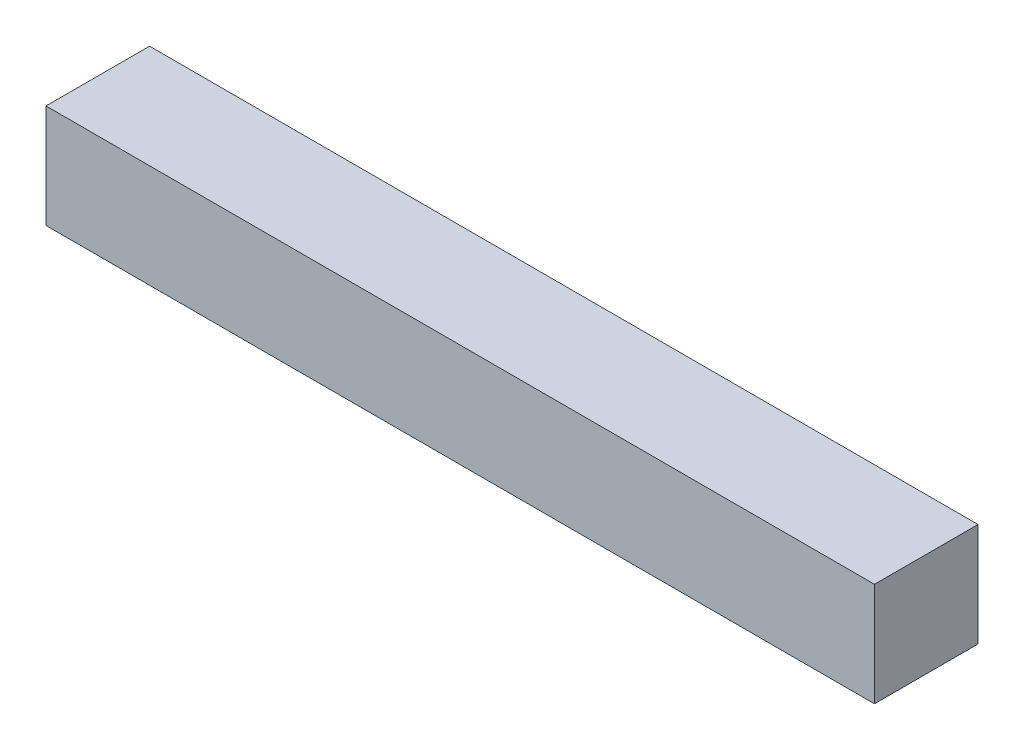
ISO-10303-21;
HEADER;
FILE_DESCRIPTION(('STEP AP214'),'2;1');
FILE_NAME('part.step','',(''),(''),'','','');
FILE_SCHEMA(('AUTOMOTIVE_DESIGN { 1 0 10303 214 1 1 1 1 }'));
ENDSEC;
DATA;
#1=APPLICATION_CONTEXT('core data for automotive mechanical design processes');
#2=APPLICATION_PROTOCOL_DEFINITION('international standard','automotive_design',2000,#1);
#3=PRODUCT_CONTEXT('',#1,'mechanical');
#4=PRODUCT('Part','Part','',(#3));
#5=PRODUCT_RELATED_PRODUCT_CATEGORY('part','',(#4));
#6=PRODUCT_DEFINITION_FORMATION('','',#4);
#7=PRODUCT_DEFINITION_CONTEXT('part definition',#1,'design');
#8=PRODUCT_DEFINITION('design','',#6,#7);
#9=PRODUCT_DEFINITION_SHAPE('','',#8);
#10=(LENGTH_UNIT() NAMED_UNIT(*) SI_UNIT(.MILLI.,.METRE.));
#11=(NAMED_UNIT(*) PLANE_ANGLE_UNIT() SI_UNIT($,.RADIAN.));
#12=(NAMED_UNIT(*) SI_UNIT($,.STERADIAN.) SOLID_ANGLE_UNIT());
#13=UNCERTAINTY_MEASURE_WITH_UNIT(LENGTH_MEASURE(1.E-05),#10,'distance_accuracy_value','');
#14=(GEOMETRIC_REPRESENTATION_CONTEXT(3) GLOBAL_UNCERTAINTY_ASSIGNED_CONTEXT((#13)) GLOBAL_UNIT_ASSIGNED_CONTEXT((#10,
#11,#12)) REPRESENTATION_CONTEXT('',''));
#15=CARTESIAN_POINT('',(0.,0.,0.));
#16=DIRECTION('',(0.,0.,1.));
#17=DIRECTION('',(1.,0.,0.));
#18=AXIS2_PLACEMENT_3D('',#15,#16,#17);
#19=CARTESIAN_POINT('',(1020.85832331262,102.108,102.108));
#20=DIRECTION('',(0.,1.,0.));
#21=DIRECTION('',(0.,0.,-1.));
#22=AXIS2_PLACEMENT_3D('',#19,#20,#21);
#23=PLANE('',#22);
#24=CARTESIAN_POINT('',(1020.85832331262,102.108,102.108));
#25=CARTESIAN_POINT('',(680.378560960894,102.108,102.108));
#26=CARTESIAN_POINT('',(339.898798609163,102.108,102.108));
#27=CARTESIAN_POINT('',(-0.580963742567401,102.108,102.108));
#28=B_SPLINE_CURVE_WITH_KNOTS('',3,(#24,#25,#26,#27),.UNSPECIFIED.,.F.,.F.,(4,4),(0.,1.),.UNSPECIFIED.);
#29=CARTESIAN_POINT('',(1020.85832331262,102.108,102.108));
#30=VERTEX_POINT('',#29);
#31=CARTESIAN_POINT('',(-0.580963742567401,102.108,102.108));
#32=VERTEX_POINT('',#31);
#33=EDGE_CURVE('E124',#30,#32,#28,.T.);
#34=ORIENTED_EDGE('',*,*,#33,.F.);
#35=DIRECTION('',(-1.,0.,0.));
#36=VECTOR('',#35,1.);
#37=CARTESIAN_POINT('',(1327.18232331262,102.108,102.108));
#38=LINE('',#37,#36);
#39=CARTESIAN_POINT('',(1327.18232331262,102.108,102.108));
#40=VERTEX_POINT('',#39);
#41=EDGE_CURVE('E253',#40,#30,#38,.T.);
#42=ORIENTED_EDGE('',*,*,#41,.F.);
#43=DIRECTION('',(0.,0.,1.));
#44=VECTOR('',#43,1.);
#45=CARTESIAN_POINT('',(1327.18232331262,102.108,102.108));
#46=LINE('',#45,#44);
#47=CARTESIAN_POINT('',(1327.18232331262,102.108,-102.108));
#48=VERTEX_POINT('',#47);
#49=EDGE_CURVE('E204',#48,#40,#46,.T.);
#50=ORIENTED_EDGE('',*,*,#49,.F.);
#51=DIRECTION('',(-1.,0.,0.));
#52=VECTOR('',#51,1.);
#53=CARTESIAN_POINT('',(1327.18232331262,102.108,-102.108));
#54=LINE('',#53,#52);
#55=CARTESIAN_POINT('',(1020.85832331262,102.108,-102.108));
#56=VERTEX_POINT('',#55);
#57=EDGE_CURVE('E214',#48,#56,#54,.T.);
#58=ORIENTED_EDGE('',*,*,#57,.T.);
#59=CARTESIAN_POINT('',(1020.85832331262,102.108,-102.108));
#60=CARTESIAN_POINT('',(680.378560960894,102.108,-102.108));
#61=CARTESIAN_POINT('',(339.898798609163,102.108,-102.108));
#62=CARTESIAN_POINT('',(-0.580963742567401,102.108,-102.108));
#63=B_SPLINE_CURVE_WITH_KNOTS('',3,(#59,#60,#61,#62),.UNSPECIFIED.,.F.,.F.,(4,4),(0.,1.),.UNSPECIFIED.);
#64=CARTESIAN_POINT('',(-0.580963742567401,102.108,-102.108));
#65=VERTEX_POINT('',#64);
#66=EDGE_CURVE('E13',#56,#65,#63,.T.);
#67=ORIENTED_EDGE('',*,*,#66,.T.);
#68=DIRECTION('',(1.,0.,0.));
#69=VECTOR('',#68,1.);
#70=CARTESIAN_POINT('',(-306.904963742567,102.108,-102.108));
#71=LINE('',#70,#69);
#72=CARTESIAN_POINT('',(-306.904963742567,102.108,-102.108));
#73=VERTEX_POINT('',#72);
#74=EDGE_CURVE('E177',#73,#65,#71,.T.);
#75=ORIENTED_EDGE('',*,*,#74,.F.);
#76=DIRECTION('',(0.,0.,1.));
#77=VECTOR('',#76,1.);
#78=CARTESIAN_POINT('',(-306.904963742567,102.108,102.108));
#79=LINE('',#78,#77);
#80=CARTESIAN_POINT('',(-306.904963742567,102.108,102.108));
#81=VERTEX_POINT('',#80);
#82=EDGE_CURVE('E179',#73,#81,#79,.T.);
#83=ORIENTED_EDGE('',*,*,#82,.T.);
#84=DIRECTION('',(1.,0.,0.));
#85=VECTOR('',#84,1.);
#86=CARTESIAN_POINT('',(-306.904963742567,102.108,102.108));
#87=LINE('',#86,#85);
#88=EDGE_CURVE('E132',#81,#32,#87,.T.);
#89=ORIENTED_EDGE('',*,*,#88,.T.);
#90=EDGE_LOOP('',(#34,#42,#50,#58,#67,#75,#83,#89));
#91=FACE_BOUND('',#90,.T.);
#92=ADVANCED_FACE('F115',(#91),#23,.T.);
#93=CARTESIAN_POINT('',(1020.85832331262,-102.108,102.108));
#94=DIRECTION('',(0.,0.,1.));
#95=DIRECTION('',(0.,1.,0.));
#96=AXIS2_PLACEMENT_3D('',#93,#94,#95);
#97=PLANE('',#96);
#98=CARTESIAN_POINT('',(1020.85832331262,-102.108,102.108));
#99=CARTESIAN_POINT('',(680.378560960894,-102.108,102.108));
#100=CARTESIAN_POINT('',(339.898798609163,-102.108,102.108));
#101=CARTESIAN_POINT('',(-0.580963742567401,-102.108,102.108));
#102=B_SPLINE_CURVE_WITH_KNOTS('',3,(#98,#99,#100,#101),.UNSPECIFIED.,.F.,.F.,(4,4),(0.,1.),.UNSPECIFIED.);
#103=CARTESIAN_POINT('',(1020.85832331262,-102.108,102.108));
#104=VERTEX_POINT('',#103);
#105=CARTESIAN_POINT('',(-0.580963742567401,-102.108,102.108));
#106=VERTEX_POINT('',#105);
#107=EDGE_CURVE('E213',#104,#106,#102,.T.);
#108=ORIENTED_EDGE('',*,*,#107,.F.);
#109=DIRECTION('',(-1.,0.,0.));
#110=VECTOR('',#109,1.);
#111=CARTESIAN_POINT('',(1327.18232331262,-102.108,102.108));
#112=LINE('',#111,#110);
#113=CARTESIAN_POINT('',(1327.18232331262,-102.108,102.108));
#114=VERTEX_POINT('',#113);
#115=EDGE_CURVE('E248',#114,#104,#112,.T.);
#116=ORIENTED_EDGE('',*,*,#115,.F.);
#117=DIRECTION('',(0.,-1.,0.));
#118=VECTOR('',#117,1.);
#119=CARTESIAN_POINT('',(1327.18232331262,-102.108,102.108));
#120=LINE('',#119,#118);
#121=EDGE_CURVE('E206',#40,#114,#120,.T.);
#122=ORIENTED_EDGE('',*,*,#121,.F.);
#123=ORIENTED_EDGE('',*,*,#41,.T.);
#124=ORIENTED_EDGE('',*,*,#33,.T.);
#125=ORIENTED_EDGE('',*,*,#88,.F.);
#126=DIRECTION('',(0.,-1.,0.));
#127=VECTOR('',#126,1.);
#128=CARTESIAN_POINT('',(-306.904963742567,-102.108,102.108));
#129=LINE('',#128,#127);
#130=CARTESIAN_POINT('',(-306.904963742567,-102.108,102.108));
#131=VERTEX_POINT('',#130);
#132=EDGE_CURVE('E193',#81,#131,#129,.T.);
#133=ORIENTED_EDGE('',*,*,#132,.T.);
#134=DIRECTION('',(1.,0.,0.));
#135=VECTOR('',#134,1.);
#136=CARTESIAN_POINT('',(-306.904963742567,-102.108,102.108));
#137=LINE('',#136,#135);
#138=EDGE_CURVE('E263',#131,#106,#137,.T.);
#139=ORIENTED_EDGE('',*,*,#138,.T.);
#140=EDGE_LOOP('',(#108,#116,#122,#123,#124,#125,#133,#139));
#141=FACE_BOUND('',#140,.T.);
#142=ADVANCED_FACE('F271',(#141),#97,.T.);
#143=CARTESIAN_POINT('',(1020.85832331262,-102.108,-102.108));
#144=DIRECTION('',(0.,-1.,0.));
#145=DIRECTION('',(0.,0.,1.));
#146=AXIS2_PLACEMENT_3D('',#143,#144,#145);
#147=PLANE('',#146);
#148=CARTESIAN_POINT('',(1020.85832331262,-102.108,-102.108));
#149=CARTESIAN_POINT('',(680.378560960894,-102.108,-102.108));
#150=CARTESIAN_POINT('',(339.898798609163,-102.108,-102.108));
#151=CARTESIAN_POINT('',(-0.580963742567401,-102.108,-102.108));
#152=B_SPLINE_CURVE_WITH_KNOTS('',3,(#148,#149,#150,#151),.UNSPECIFIED.,.F.,.F.,(4,4),(0.,1.),.UNSPECIFIED.);
#153=CARTESIAN_POINT('',(1020.85832331262,-102.108,-102.108));
#154=VERTEX_POINT('',#153);
#155=CARTESIAN_POINT('',(-0.580963742567401,-102.108,-102.108));
#156=VERTEX_POINT('',#155);
#157=EDGE_CURVE('E211',#154,#156,#152,.T.);
#158=ORIENTED_EDGE('',*,*,#157,.F.);
#159=DIRECTION('',(-1.,0.,0.));
#160=VECTOR('',#159,1.);
#161=CARTESIAN_POINT('',(1327.18232331262,-102.108,-102.108));
#162=LINE('',#161,#160);
#163=CARTESIAN_POINT('',(1327.18232331262,-102.108,-102.108));
#164=VERTEX_POINT('',#163);
#165=EDGE_CURVE('E210',#164,#154,#162,.T.);
#166=ORIENTED_EDGE('',*,*,#165,.F.);
#167=DIRECTION('',(0.,0.,-1.));
#168=VECTOR('',#167,1.);
#169=CARTESIAN_POINT('',(1327.18232331262,-102.108,102.108));
#170=LINE('',#169,#168);
#171=EDGE_CURVE('E208',#114,#164,#170,.T.);
#172=ORIENTED_EDGE('',*,*,#171,.F.);
#173=ORIENTED_EDGE('',*,*,#115,.T.);
#174=ORIENTED_EDGE('',*,*,#107,.T.);
#175=ORIENTED_EDGE('',*,*,#138,.F.);
#176=DIRECTION('',(0.,0.,-1.));
#177=VECTOR('',#176,1.);
#178=CARTESIAN_POINT('',(-306.904963742567,-102.108,102.108));
#179=LINE('',#178,#177);
#180=CARTESIAN_POINT('',(-306.904963742567,-102.108,-102.108));
#181=VERTEX_POINT('',#180);
#182=EDGE_CURVE('E183',#131,#181,#179,.T.);
#183=ORIENTED_EDGE('',*,*,#182,.T.);
#184=DIRECTION('',(1.,0.,0.));
#185=VECTOR('',#184,1.);
#186=CARTESIAN_POINT('',(-306.904963742567,-102.108,-102.108));
#187=LINE('',#186,#185);
#188=EDGE_CURVE('E196',#181,#156,#187,.T.);
#189=ORIENTED_EDGE('',*,*,#188,.T.);
#190=EDGE_LOOP('',(#158,#166,#172,#173,#174,#175,#183,#189));
#191=FACE_BOUND('',#190,.T.);
#192=ADVANCED_FACE('F274',(#191),#147,.T.);
#193=CARTESIAN_POINT('',(1020.85832331262,102.108,-102.108));
#194=DIRECTION('',(0.,0.,-1.));
#195=DIRECTION('',(0.,-1.,0.));
#196=AXIS2_PLACEMENT_3D('',#193,#194,#195);
#197=PLANE('',#196);
#198=ORIENTED_EDGE('',*,*,#66,.F.);
#199=ORIENTED_EDGE('',*,*,#57,.F.);
#200=DIRECTION('',(0.,1.,0.));
#201=VECTOR('',#200,1.);
#202=CARTESIAN_POINT('',(1327.18232331262,-102.108,-102.108));
#203=LINE('',#202,#201);
#204=EDGE_CURVE('E201',#164,#48,#203,.T.);
#205=ORIENTED_EDGE('',*,*,#204,.F.);
#206=ORIENTED_EDGE('',*,*,#165,.T.);
#207=ORIENTED_EDGE('',*,*,#157,.T.);
#208=ORIENTED_EDGE('',*,*,#188,.F.);
#209=DIRECTION('',(0.,1.,0.));
#210=VECTOR('',#209,1.);
#211=CARTESIAN_POINT('',(-306.904963742567,-102.108,-102.108));
#212=LINE('',#211,#210);
#213=EDGE_CURVE('E190',#181,#73,#212,.T.);
#214=ORIENTED_EDGE('',*,*,#213,.T.);
#215=ORIENTED_EDGE('',*,*,#74,.T.);
#216=EDGE_LOOP('',(#198,#199,#205,#206,#207,#208,#214,#215));
#217=FACE_BOUND('',#216,.T.);
#218=ADVANCED_FACE('F117',(#217),#197,.T.);
#219=CARTESIAN_POINT('',(1327.18232331262,0.,0.));
#220=DIRECTION('',(-1.,0.,0.));
#221=DIRECTION('',(0.,0.,1.));
#222=AXIS2_PLACEMENT_3D('',#219,#220,#221);
#223=PLANE('',#222);
#224=ORIENTED_EDGE('',*,*,#204,.T.);
#225=ORIENTED_EDGE('',*,*,#49,.T.);
#226=ORIENTED_EDGE('',*,*,#121,.T.);
#227=ORIENTED_EDGE('',*,*,#171,.T.);
#228=EDGE_LOOP('',(#224,#225,#226,#227));
#229=FACE_BOUND('',#228,.T.);
#230=ADVANCED_FACE('F279',(#229),#223,.F.);
#231=CARTESIAN_POINT('',(-306.904963742567,0.,0.));
#232=DIRECTION('',(-1.,0.,0.));
#233=DIRECTION('',(0.,0.,1.));
#234=AXIS2_PLACEMENT_3D('',#231,#232,#233);
#235=PLANE('',#234);
#236=ORIENTED_EDGE('',*,*,#213,.F.);
#237=ORIENTED_EDGE('',*,*,#182,.F.);
#238=ORIENTED_EDGE('',*,*,#132,.F.);
#239=ORIENTED_EDGE('',*,*,#82,.F.);
#240=EDGE_LOOP('',(#236,#237,#238,#239));
#241=FACE_BOUND('',#240,.T.);
#242=ADVANCED_FACE('F188',(#241),#235,.T.);
#243=CLOSED_SHELL('',(#92,#142,#192,#218,#230,#242));
#244=MANIFOLD_SOLID_BREP('B2',#243);
#245=ADVANCED_BREP_SHAPE_REPRESENTATION('',(#18,#244),#14);
#246=SHAPE_DEFINITION_REPRESENTATION(#9,#245);
ENDSEC;
END-ISO-10303-21;
